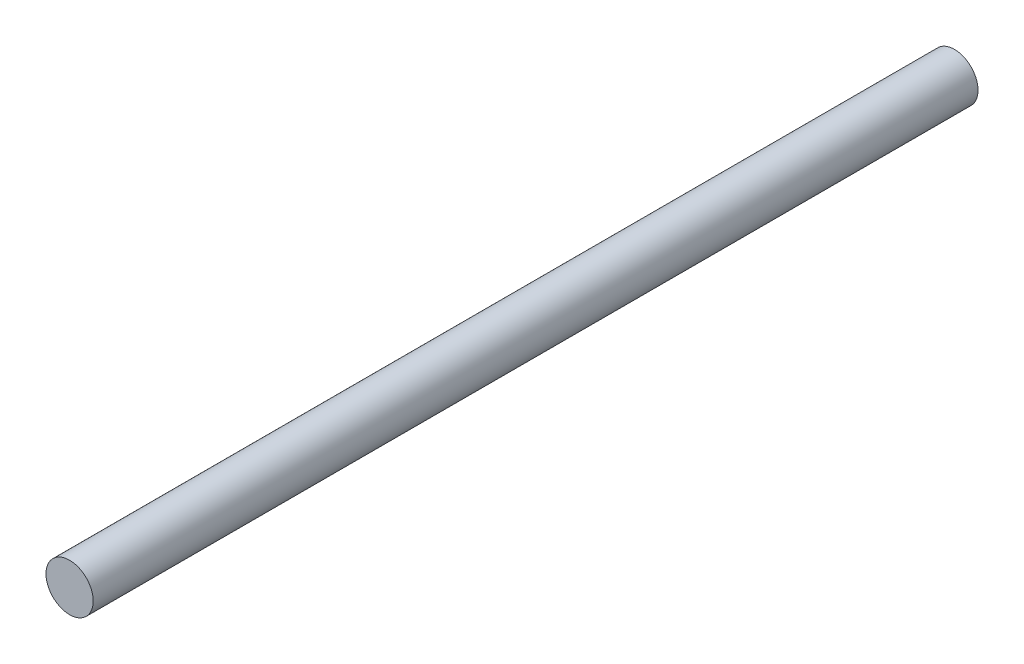
ISO-10303-21;
HEADER;
FILE_DESCRIPTION(('STEP AP214'),'2;1');
FILE_NAME('part.step','',(''),(''),'','','');
FILE_SCHEMA(('AUTOMOTIVE_DESIGN { 1 0 10303 214 1 1 1 1 }'));
ENDSEC;
DATA;
#1=APPLICATION_CONTEXT('core data for automotive mechanical design processes');
#2=APPLICATION_PROTOCOL_DEFINITION('international standard','automotive_design',2000,#1);
#3=PRODUCT_CONTEXT('',#1,'mechanical');
#4=PRODUCT('Part','Part','',(#3));
#5=PRODUCT_RELATED_PRODUCT_CATEGORY('part','',(#4));
#6=PRODUCT_DEFINITION_FORMATION('','',#4);
#7=PRODUCT_DEFINITION_CONTEXT('part definition',#1,'design');
#8=PRODUCT_DEFINITION('design','',#6,#7);
#9=PRODUCT_DEFINITION_SHAPE('','',#8);
#10=(LENGTH_UNIT() NAMED_UNIT(*) SI_UNIT(.MILLI.,.METRE.));
#11=(NAMED_UNIT(*) PLANE_ANGLE_UNIT() SI_UNIT($,.RADIAN.));
#12=(NAMED_UNIT(*) SI_UNIT($,.STERADIAN.) SOLID_ANGLE_UNIT());
#13=UNCERTAINTY_MEASURE_WITH_UNIT(LENGTH_MEASURE(1.E-05),#10,'distance_accuracy_value','');
#14=(GEOMETRIC_REPRESENTATION_CONTEXT(3) GLOBAL_UNCERTAINTY_ASSIGNED_CONTEXT((#13)) GLOBAL_UNIT_ASSIGNED_CONTEXT((#10,
#11,#12)) REPRESENTATION_CONTEXT('',''));
#15=CARTESIAN_POINT('',(0.,0.,0.));
#16=DIRECTION('',(0.,0.,1.));
#17=DIRECTION('',(1.,0.,0.));
#18=AXIS2_PLACEMENT_3D('',#15,#16,#17);
#19=CARTESIAN_POINT('',(0.,0.,-129.));
#20=DIRECTION('',(0.,0.,1.));
#21=DIRECTION('',(1.,0.,0.));
#22=AXIS2_PLACEMENT_3D('',#19,#20,#21);
#23=CYLINDRICAL_SURFACE('',#22,4.);
#24=CARTESIAN_POINT('',(0.,0.,-129.));
#25=DIRECTION('',(0.,0.,-1.));
#26=DIRECTION('',(-1.,0.,0.));
#27=AXIS2_PLACEMENT_3D('',#24,#25,#26);
#28=CIRCLE('',#27,4.);
#29=CARTESIAN_POINT('',(-4.,0.,-129.));
#30=VERTEX_POINT('',#29);
#31=EDGE_CURVE('E10',#30,#30,#28,.T.);
#32=ORIENTED_EDGE('',*,*,#31,.F.);
#33=EDGE_LOOP('',(#32));
#34=FACE_BOUND('',#33,.T.);
#35=CARTESIAN_POINT('',(0.,0.,21.));
#36=DIRECTION('',(0.,0.,-1.));
#37=DIRECTION('',(-1.,0.,0.));
#38=AXIS2_PLACEMENT_3D('',#35,#36,#37);
#39=CIRCLE('',#38,4.);
#40=CARTESIAN_POINT('',(-4.,0.,21.));
#41=VERTEX_POINT('',#40);
#42=EDGE_CURVE('E31',#41,#41,#39,.T.);
#43=ORIENTED_EDGE('',*,*,#42,.T.);
#44=EDGE_LOOP('',(#43));
#45=FACE_BOUND('',#44,.T.);
#46=ADVANCED_FACE('F28',(#34,#45),#23,.T.);
#47=CARTESIAN_POINT('',(0.,0.,-129.));
#48=DIRECTION('',(0.,0.,-1.));
#49=DIRECTION('',(-1.,0.,0.));
#50=AXIS2_PLACEMENT_3D('',#47,#48,#49);
#51=PLANE('',#50);
#52=ORIENTED_EDGE('',*,*,#31,.T.);
#53=EDGE_LOOP('',(#52));
#54=FACE_BOUND('',#53,.T.);
#55=ADVANCED_FACE('F43',(#54),#51,.T.);
#56=CARTESIAN_POINT('',(0.,0.,21.));
#57=DIRECTION('',(0.,0.,-1.));
#58=DIRECTION('',(-1.,0.,0.));
#59=AXIS2_PLACEMENT_3D('',#56,#57,#58);
#60=PLANE('',#59);
#61=ORIENTED_EDGE('',*,*,#42,.F.);
#62=EDGE_LOOP('',(#61));
#63=FACE_BOUND('',#62,.T.);
#64=ADVANCED_FACE('F41',(#63),#60,.F.);
#65=CLOSED_SHELL('',(#46,#55,#64));
#66=MANIFOLD_SOLID_BREP('B2',#65);
#67=ADVANCED_BREP_SHAPE_REPRESENTATION('',(#18,#66),#14);
#68=SHAPE_DEFINITION_REPRESENTATION(#9,#67);
ENDSEC;
END-ISO-10303-21;
